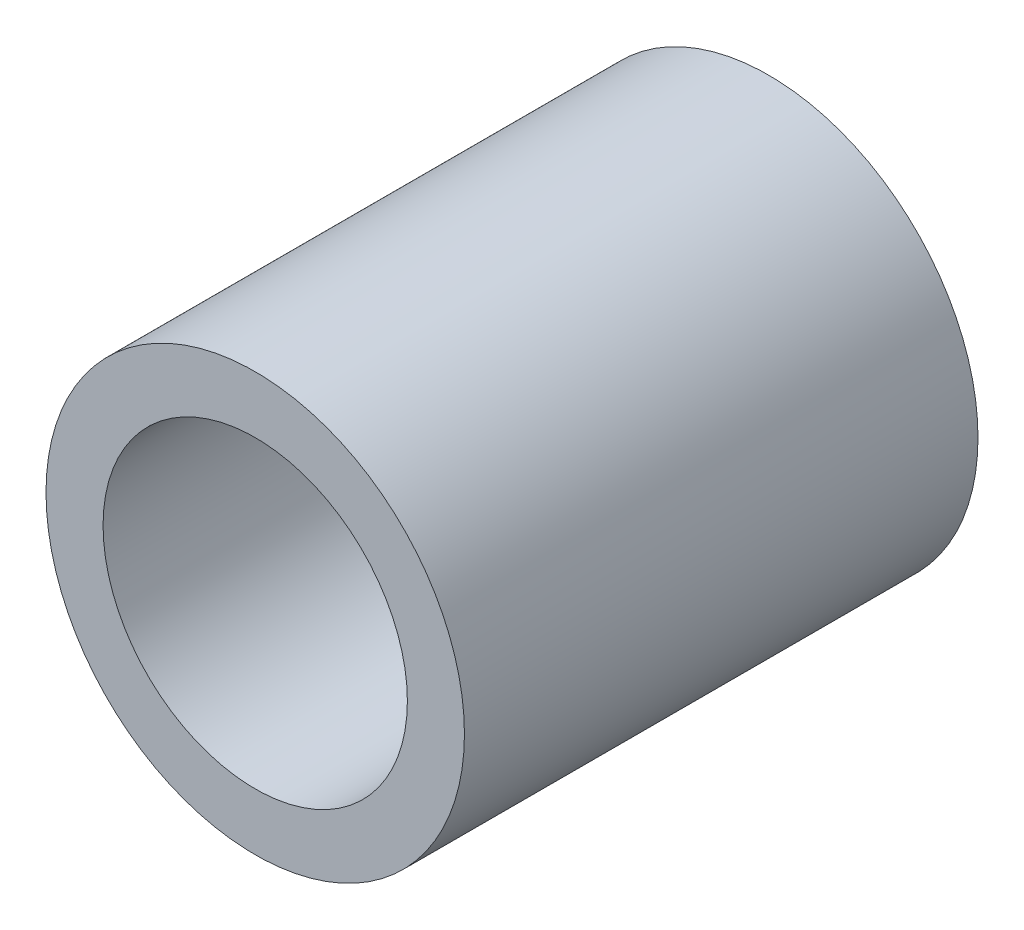
ISO-10303-21;
HEADER;
FILE_DESCRIPTION(('STEP AP214'),'2;1');
FILE_NAME('part.step','',(''),(''),'','','');
FILE_SCHEMA(('AUTOMOTIVE_DESIGN { 1 0 10303 214 1 1 1 1 }'));
ENDSEC;
DATA;
#1=APPLICATION_CONTEXT('core data for automotive mechanical design processes');
#2=APPLICATION_PROTOCOL_DEFINITION('international standard','automotive_design',2000,#1);
#3=PRODUCT_CONTEXT('',#1,'mechanical');
#4=PRODUCT('Part','Part','',(#3));
#5=PRODUCT_RELATED_PRODUCT_CATEGORY('part','',(#4));
#6=PRODUCT_DEFINITION_FORMATION('','',#4);
#7=PRODUCT_DEFINITION_CONTEXT('part definition',#1,'design');
#8=PRODUCT_DEFINITION('design','',#6,#7);
#9=PRODUCT_DEFINITION_SHAPE('','',#8);
#10=(LENGTH_UNIT() NAMED_UNIT(*) SI_UNIT(.MILLI.,.METRE.));
#11=(NAMED_UNIT(*) PLANE_ANGLE_UNIT() SI_UNIT($,.RADIAN.));
#12=(NAMED_UNIT(*) SI_UNIT($,.STERADIAN.) SOLID_ANGLE_UNIT());
#13=UNCERTAINTY_MEASURE_WITH_UNIT(LENGTH_MEASURE(1.E-05),#10,'distance_accuracy_value','');
#14=(GEOMETRIC_REPRESENTATION_CONTEXT(3) GLOBAL_UNCERTAINTY_ASSIGNED_CONTEXT((#13)) GLOBAL_UNIT_ASSIGNED_CONTEXT((#10,
#11,#12)) REPRESENTATION_CONTEXT('',''));
#15=CARTESIAN_POINT('',(0.,0.,0.));
#16=DIRECTION('',(0.,0.,1.));
#17=DIRECTION('',(1.,0.,0.));
#18=AXIS2_PLACEMENT_3D('',#15,#16,#17);
#19=CARTESIAN_POINT('',(0.,0.,-27.));
#20=DIRECTION('',(0.,0.,1.));
#21=DIRECTION('',(1.,0.,0.));
#22=AXIS2_PLACEMENT_3D('',#19,#20,#21);
#23=CYLINDRICAL_SURFACE('',#22,11.);
#24=CARTESIAN_POINT('',(0.,0.,-27.));
#25=DIRECTION('',(0.,0.,1.));
#26=DIRECTION('',(1.,0.,0.));
#27=AXIS2_PLACEMENT_3D('',#24,#25,#26);
#28=CIRCLE('',#27,11.);
#29=CARTESIAN_POINT('',(11.,0.,-27.));
#30=VERTEX_POINT('',#29);
#31=EDGE_CURVE('E10',#30,#30,#28,.T.);
#32=ORIENTED_EDGE('',*,*,#31,.T.);
#33=EDGE_LOOP('',(#32));
#34=FACE_BOUND('',#33,.T.);
#35=CARTESIAN_POINT('',(0.,0.,0.));
#36=DIRECTION('',(0.,0.,1.));
#37=DIRECTION('',(1.,0.,0.));
#38=AXIS2_PLACEMENT_3D('',#35,#36,#37);
#39=CIRCLE('',#38,11.);
#40=CARTESIAN_POINT('',(11.,0.,0.));
#41=VERTEX_POINT('',#40);
#42=EDGE_CURVE('E33',#41,#41,#39,.T.);
#43=ORIENTED_EDGE('',*,*,#42,.F.);
#44=EDGE_LOOP('',(#43));
#45=FACE_BOUND('',#44,.T.);
#46=ADVANCED_FACE('F30',(#34,#45),#23,.T.);
#47=CARTESIAN_POINT('',(0.,0.,-27.));
#48=DIRECTION('',(0.,0.,1.));
#49=DIRECTION('',(1.,0.,0.));
#50=AXIS2_PLACEMENT_3D('',#47,#48,#49);
#51=PLANE('',#50);
#52=CARTESIAN_POINT('',(0.,0.,-27.));
#53=DIRECTION('',(0.,0.,1.));
#54=DIRECTION('',(1.,0.,0.));
#55=AXIS2_PLACEMENT_3D('',#52,#53,#54);
#56=CIRCLE('',#55,8.);
#57=CARTESIAN_POINT('',(8.,0.,-27.));
#58=VERTEX_POINT('',#57);
#59=EDGE_CURVE('E40',#58,#58,#56,.T.);
#60=ORIENTED_EDGE('',*,*,#59,.T.);
#61=EDGE_LOOP('',(#60));
#62=FACE_BOUND('',#61,.T.);
#63=ORIENTED_EDGE('',*,*,#31,.F.);
#64=EDGE_LOOP('',(#63));
#65=FACE_BOUND('',#64,.T.);
#66=ADVANCED_FACE('F48',(#62,#65),#51,.F.);
#67=CARTESIAN_POINT('',(0.,0.,0.));
#68=DIRECTION('',(0.,0.,1.));
#69=DIRECTION('',(1.,0.,0.));
#70=AXIS2_PLACEMENT_3D('',#67,#68,#69);
#71=PLANE('',#70);
#72=CARTESIAN_POINT('',(0.,0.,0.));
#73=DIRECTION('',(0.,0.,1.));
#74=DIRECTION('',(1.,0.,0.));
#75=AXIS2_PLACEMENT_3D('',#72,#73,#74);
#76=CIRCLE('',#75,8.);
#77=CARTESIAN_POINT('',(8.,0.,0.));
#78=VERTEX_POINT('',#77);
#79=EDGE_CURVE('E42',#78,#78,#76,.T.);
#80=ORIENTED_EDGE('',*,*,#79,.F.);
#81=EDGE_LOOP('',(#80));
#82=FACE_BOUND('',#81,.T.);
#83=ORIENTED_EDGE('',*,*,#42,.T.);
#84=EDGE_LOOP('',(#83));
#85=FACE_BOUND('',#84,.T.);
#86=ADVANCED_FACE('F54',(#82,#85),#71,.T.);
#87=CARTESIAN_POINT('',(0.,0.,-27.));
#88=DIRECTION('',(0.,0.,1.));
#89=DIRECTION('',(1.,0.,0.));
#90=AXIS2_PLACEMENT_3D('',#87,#88,#89);
#91=CYLINDRICAL_SURFACE('',#90,8.);
#92=ORIENTED_EDGE('',*,*,#59,.F.);
#93=EDGE_LOOP('',(#92));
#94=FACE_BOUND('',#93,.T.);
#95=ORIENTED_EDGE('',*,*,#79,.T.);
#96=EDGE_LOOP('',(#95));
#97=FACE_BOUND('',#96,.T.);
#98=ADVANCED_FACE('F51',(#94,#97),#91,.F.);
#99=CLOSED_SHELL('',(#46,#66,#86,#98));
#100=MANIFOLD_SOLID_BREP('B2',#99);
#101=ADVANCED_BREP_SHAPE_REPRESENTATION('',(#18,#100),#14);
#102=SHAPE_DEFINITION_REPRESENTATION(#9,#101);
ENDSEC;
END-ISO-10303-21;
